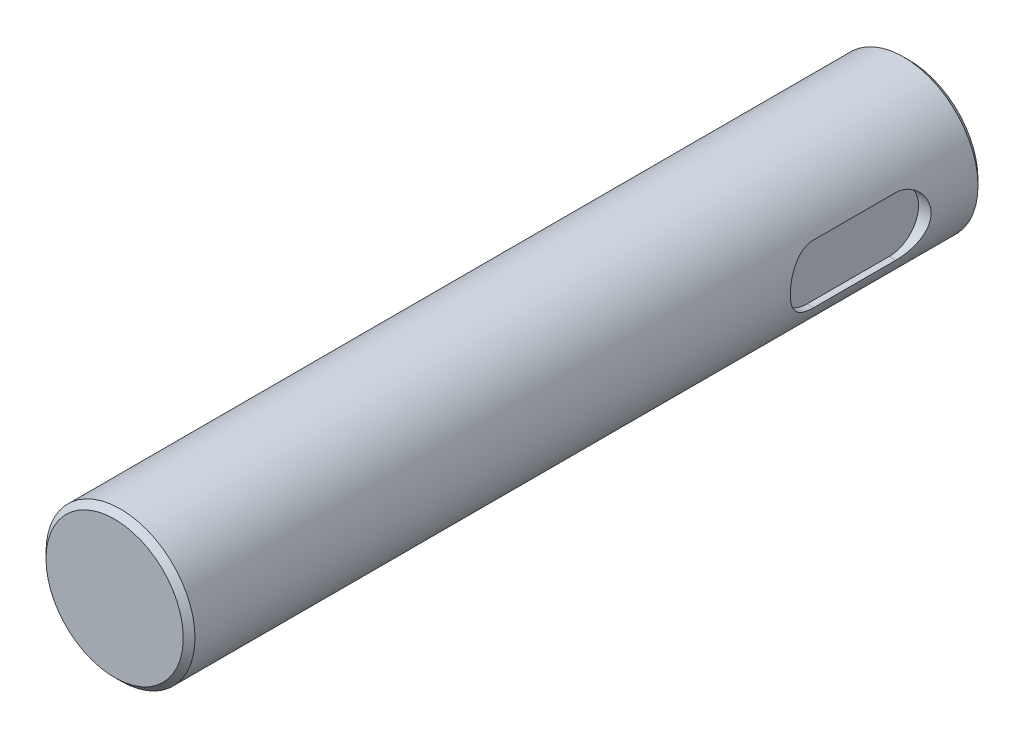
ISO-10303-21;
HEADER;
FILE_DESCRIPTION(('STEP AP214'),'2;1');
FILE_NAME('part.step','',(''),(''),'','','');
FILE_SCHEMA(('AUTOMOTIVE_DESIGN { 1 0 10303 214 1 1 1 1 }'));
ENDSEC;
DATA;
#1=APPLICATION_CONTEXT('core data for automotive mechanical design processes');
#2=APPLICATION_PROTOCOL_DEFINITION('international standard','automotive_design',2000,#1);
#3=PRODUCT_CONTEXT('',#1,'mechanical');
#4=PRODUCT('Part','Part','',(#3));
#5=PRODUCT_RELATED_PRODUCT_CATEGORY('part','',(#4));
#6=PRODUCT_DEFINITION_FORMATION('','',#4);
#7=PRODUCT_DEFINITION_CONTEXT('part definition',#1,'design');
#8=PRODUCT_DEFINITION('design','',#6,#7);
#9=PRODUCT_DEFINITION_SHAPE('','',#8);
#10=(LENGTH_UNIT() NAMED_UNIT(*) SI_UNIT(.MILLI.,.METRE.));
#11=(NAMED_UNIT(*) PLANE_ANGLE_UNIT() SI_UNIT($,.RADIAN.));
#12=(NAMED_UNIT(*) SI_UNIT($,.STERADIAN.) SOLID_ANGLE_UNIT());
#13=UNCERTAINTY_MEASURE_WITH_UNIT(LENGTH_MEASURE(1.E-05),#10,'distance_accuracy_value','');
#14=(GEOMETRIC_REPRESENTATION_CONTEXT(3) GLOBAL_UNCERTAINTY_ASSIGNED_CONTEXT((#13)) GLOBAL_UNIT_ASSIGNED_CONTEXT((#10,
#11,#12)) REPRESENTATION_CONTEXT('',''));
#15=CARTESIAN_POINT('',(0.,0.,0.));
#16=DIRECTION('',(0.,0.,1.));
#17=DIRECTION('',(1.,0.,0.));
#18=AXIS2_PLACEMENT_3D('',#15,#16,#17);
#19=CARTESIAN_POINT('',(0.,0.,-67.75));
#20=DIRECTION('',(0.,0.,1.));
#21=DIRECTION('',(1.,0.,0.));
#22=AXIS2_PLACEMENT_3D('',#19,#20,#21);
#23=PLANE('',#22);
#24=CARTESIAN_POINT('',(0.,0.,-67.75));
#25=DIRECTION('',(0.,0.,1.));
#26=DIRECTION('',(1.,0.,0.));
#27=AXIS2_PLACEMENT_3D('',#24,#25,#26);
#28=CIRCLE('',#27,5.84999999999999);
#29=CARTESIAN_POINT('',(5.84999999999999,0.,-67.75));
#30=VERTEX_POINT('',#29);
#31=EDGE_CURVE('E125',#30,#30,#28,.F.);
#32=ORIENTED_EDGE('',*,*,#31,.T.);
#33=EDGE_LOOP('',(#32));
#34=FACE_BOUND('',#33,.T.);
#35=ADVANCED_FACE('F39',(#34),#23,.F.);
#36=CARTESIAN_POINT('',(0.,0.,0.));
#37=DIRECTION('',(0.,0.,1.));
#38=DIRECTION('',(1.,0.,0.));
#39=AXIS2_PLACEMENT_3D('',#36,#37,#38);
#40=CYLINDRICAL_SURFACE('',#39,6.35);
#41=DIRECTION('',(0.,0.,1.));
#42=VECTOR('',#41,1.);
#43=CARTESIAN_POINT('',(5.83716540796987,2.5,0.));
#44=LINE('',#43,#42);
#45=CARTESIAN_POINT('',(5.83716540796987,2.5,-53.75));
#46=VERTEX_POINT('',#45);
#47=CARTESIAN_POINT('',(5.83716540796987,2.5,-60.75));
#48=VERTEX_POINT('',#47);
#49=EDGE_CURVE('E11',#46,#48,#44,.F.);
#50=ORIENTED_EDGE('',*,*,#49,.T.);
#51=CARTESIAN_POINT('',(5.83716540796987,2.5,-60.75));
#52=CARTESIAN_POINT('',(5.8371518919221,2.50000987478213,-60.8173550812143));
#53=CARTESIAN_POINT('',(5.83833089695258,2.49727823819387,-60.8847027700808));
#54=CARTESIAN_POINT('',(5.84297299306989,2.48640909552985,-61.018857101362));
#55=CARTESIAN_POINT('',(5.84643524116455,2.47827358460103,-61.0856639342537));
#56=CARTESIAN_POINT('',(5.85552556625778,2.45671510047975,-61.2180068502714));
#57=CARTESIAN_POINT('',(5.86114529843872,2.44331249493611,-61.2835468200074));
#58=CARTESIAN_POINT('',(5.87435928229259,2.41136898179004,-61.413143515974));
#59=CARTESIAN_POINT('',(5.88195364922099,2.39282777425358,-61.4772001553879));
#60=CARTESIAN_POINT('',(5.90734146262765,2.3297830960617,-61.6663660513068));
#61=CARTESIAN_POINT('',(5.92775864688554,2.2778161933338,-61.7887275416302));
#62=CARTESIAN_POINT('',(5.97326182534834,2.15566005868811,-62.0230441619064));
#63=CARTESIAN_POINT('',(5.99835209337196,2.08545412267192,-62.1349896240946));
#64=CARTESIAN_POINT('',(6.0519032396005,1.924703225297,-62.3514261808795));
#65=CARTESIAN_POINT('',(6.08046963387795,1.83332125628766,-62.4552708715946));
#66=CARTESIAN_POINT('',(6.13687860758837,1.63458906115231,-62.6466172492597));
#67=CARTESIAN_POINT('',(6.16472103971432,1.52723561466619,-62.7341156322274));
#68=CARTESIAN_POINT('',(6.21782414353303,1.29457106072578,-62.8935270160531));
#69=CARTESIAN_POINT('',(6.24294610873363,1.16873175753819,-62.9647195548644));
#70=CARTESIAN_POINT('',(6.28648865354135,0.9056993877024,-63.08464693297));
#71=CARTESIAN_POINT('',(6.30491195227754,0.768510955724711,-63.1333908867623));
#72=CARTESIAN_POINT('',(6.33222833403855,0.493523064939962,-63.2047200097026));
#73=CARTESIAN_POINT('',(6.341529158504,0.356056272193898,-63.2284284005797));
#74=CARTESIAN_POINT('',(6.351023804053,0.0787992330405364,-63.2526257750494));
#75=CARTESIAN_POINT('',(6.3512207410461,-0.0609902020288036,-63.2531227030312));
#76=CARTESIAN_POINT('',(6.34273602340464,-0.330820384385018,-63.2315076911508));
#77=CARTESIAN_POINT('',(6.33453718300954,-0.460977525113898,-63.2106252259453));
#78=CARTESIAN_POINT('',(6.31082863654111,-0.715765136693252,-63.1489299706289));
#79=CARTESIAN_POINT('',(6.29531851600277,-0.840395293789415,-63.1081160506304));
#80=CARTESIAN_POINT('',(6.25821672153607,-1.0828199291725,-63.0072113727838));
#81=CARTESIAN_POINT('',(6.23653747489002,-1.20048413314028,-62.9468411623745));
#82=CARTESIAN_POINT('',(6.18925968154747,-1.4243139627364,-62.8087945086935));
#83=CARTESIAN_POINT('',(6.1636597838798,-1.53047560321871,-62.7311120957972));
#84=CARTESIAN_POINT('',(6.109222290015,-1.73547129987141,-62.5548700018132));
#85=CARTESIAN_POINT('',(6.08028233057431,-1.83340642084681,-62.4552949148351));
#86=CARTESIAN_POINT('',(6.02369286608497,-2.01156229908132,-62.2409866036205));
#87=CARTESIAN_POINT('',(5.99604393068416,-2.09177529385489,-62.1262467720874));
#88=CARTESIAN_POINT('',(5.94447412112461,-2.23419669705954,-61.8809390613136));
#89=CARTESIAN_POINT('',(5.92067477322377,-2.29585745886071,-61.7500261587005));
#90=CARTESIAN_POINT('',(5.88093522688929,-2.39583746377496,-61.4785567890377));
#91=CARTESIAN_POINT('',(5.8649813239036,-2.43419743686662,-61.3380176302308));
#92=CARTESIAN_POINT('',(5.84852785117289,-2.47334005569358,-61.1216981406457));
#93=CARTESIAN_POINT('',(5.84428585186628,-2.48332518307775,-61.0477571313768));
#94=CARTESIAN_POINT('',(5.83859880772277,-2.49665534609488,-60.8992260128261));
#95=CARTESIAN_POINT('',(5.83715179627329,-2.50000505059412,-60.8246363970651));
#96=CARTESIAN_POINT('',(5.83716540796986,-2.5,-60.75));
#97=B_SPLINE_CURVE_WITH_KNOTS('',3,(#51,#52,#53,#54,#55,#56,#57,#58,#59,#60,#61,#62,#63,#64,#65,
#66,#67,#68,#69,#70,#71,#72,#73,#74,#75,#76,#77,#78,#79,#80,#81,#82,#83,#84,#85,#86,#87,#88,#89,
#90,#91,#92,#93,#94,#95,#96),.UNSPECIFIED.,.F.,.F.,(4,2,2,2,2,2,2,2,2,2,2,2,2,2,2,2,2,2,2,2,2,2,
4),(0.,0.201987224760544,0.403899915893151,0.605039382214785,0.806190591278725,1.20772153227728,
1.60962151713862,2.03148309093361,2.45342984107112,2.89144603935135,3.32928423865767,
3.7465149344843,4.16360282727851,4.5579822242233,4.9523839806073,5.35269047160806,
5.75313521117212,6.1791150998532,6.60528120411173,7.04301191062807,7.47997524151536,
7.7038630882788,7.92759334535097),.UNSPECIFIED.);
#98=CARTESIAN_POINT('',(5.83716540796987,-2.5,-60.75));
#99=VERTEX_POINT('',#98);
#100=EDGE_CURVE('E133',#48,#99,#97,.T.);
#101=ORIENTED_EDGE('',*,*,#100,.T.);
#102=DIRECTION('',(0.,0.,1.));
#103=VECTOR('',#102,1.);
#104=CARTESIAN_POINT('',(5.83716540796987,-2.5,0.));
#105=LINE('',#104,#103);
#106=CARTESIAN_POINT('',(5.83716540796987,-2.5,-53.75));
#107=VERTEX_POINT('',#106);
#108=EDGE_CURVE('E48',#99,#107,#105,.T.);
#109=ORIENTED_EDGE('',*,*,#108,.T.);
#110=CARTESIAN_POINT('',(5.83716540796987,-2.5,-53.75));
#111=CARTESIAN_POINT('',(5.8371518919221,-2.50000987478213,-53.6826449187857));
#112=CARTESIAN_POINT('',(5.83833089695258,-2.49727823819387,-53.6152972299192));
#113=CARTESIAN_POINT('',(5.84297299306989,-2.48640909552985,-53.481142898638));
#114=CARTESIAN_POINT('',(5.84643524116455,-2.47827358460103,-53.4143360657463));
#115=CARTESIAN_POINT('',(5.85552556625778,-2.45671510047975,-53.2819931497286));
#116=CARTESIAN_POINT('',(5.86114529843872,-2.44331249493611,-53.2164531799927));
#117=CARTESIAN_POINT('',(5.87435928229259,-2.41136898179004,-53.086856484026));
#118=CARTESIAN_POINT('',(5.88195364922098,-2.39282777425358,-53.0227998446122));
#119=CARTESIAN_POINT('',(5.90734146262765,-2.3297830960617,-52.8336339486932));
#120=CARTESIAN_POINT('',(5.92775864688554,-2.2778161933338,-52.7112724583699));
#121=CARTESIAN_POINT('',(5.97326182534834,-2.15566005868811,-52.4769558380936));
#122=CARTESIAN_POINT('',(5.99835209337196,-2.08545412267192,-52.3650103759054));
#123=CARTESIAN_POINT('',(6.0519032396005,-1.924703225297,-52.1485738191205));
#124=CARTESIAN_POINT('',(6.08046963387795,-1.83332125628765,-52.0447291284054));
#125=CARTESIAN_POINT('',(6.13687860758838,-1.6345890611523,-51.8533827507403));
#126=CARTESIAN_POINT('',(6.16472103971432,-1.52723561466618,-51.7658843677726));
#127=CARTESIAN_POINT('',(6.21782414353303,-1.29457106072577,-51.6064729839469));
#128=CARTESIAN_POINT('',(6.24294610873363,-1.16873175753818,-51.5352804451356));
#129=CARTESIAN_POINT('',(6.28648865354135,-0.90569938770239,-51.41535306703));
#130=CARTESIAN_POINT('',(6.30491195227754,-0.768510955724701,-51.3666091132377));
#131=CARTESIAN_POINT('',(6.33222833403855,-0.493523064939954,-51.2952799902974));
#132=CARTESIAN_POINT('',(6.341529158504,-0.356056272193893,-51.2715715994203));
#133=CARTESIAN_POINT('',(6.351023804053,-0.0787992330405341,-51.2473742249506));
#134=CARTESIAN_POINT('',(6.3512207410461,0.0609902020288047,-51.2468772969688));
#135=CARTESIAN_POINT('',(6.34273602340464,0.330820384385017,-51.2684923088492));
#136=CARTESIAN_POINT('',(6.33453718300954,0.460977525113896,-51.2893747740547));
#137=CARTESIAN_POINT('',(6.31082863654111,0.71576513669325,-51.3510700293711));
#138=CARTESIAN_POINT('',(6.29531851600277,0.840395293789414,-51.3918839493696));
#139=CARTESIAN_POINT('',(6.25821672153607,1.0828199291725,-51.4927886272162));
#140=CARTESIAN_POINT('',(6.23653747489002,1.20048413314028,-51.5531588376255));
#141=CARTESIAN_POINT('',(6.18925968154747,1.4243139627364,-51.6912054913066));
#142=CARTESIAN_POINT('',(6.1636597838798,1.5304756032187,-51.7688879042028));
#143=CARTESIAN_POINT('',(6.109222290015,1.73547129987141,-51.9451299981868));
#144=CARTESIAN_POINT('',(6.08028233057431,1.83340642084681,-52.0447050851649));
#145=CARTESIAN_POINT('',(6.02369286608497,2.01156229908132,-52.2590133963795));
#146=CARTESIAN_POINT('',(5.99604393068416,2.09177529385489,-52.3737532279126));
#147=CARTESIAN_POINT('',(5.9444741211246,2.23419669705954,-52.6190609386864));
#148=CARTESIAN_POINT('',(5.92067477322377,2.29585745886071,-52.7499738412995));
#149=CARTESIAN_POINT('',(5.88093522688929,2.39583746377496,-53.0214432109623));
#150=CARTESIAN_POINT('',(5.8649813239036,2.43419743686662,-53.1619823697692));
#151=CARTESIAN_POINT('',(5.84852785117289,2.47334005569358,-53.3783018593543));
#152=CARTESIAN_POINT('',(5.84428585186628,2.48332518307775,-53.4522428686232));
#153=CARTESIAN_POINT('',(5.83859880772277,2.49665534609488,-53.6007739871739));
#154=CARTESIAN_POINT('',(5.83715179627329,2.50000505059412,-53.675363602935));
#155=CARTESIAN_POINT('',(5.83716540796986,2.5,-53.75));
#156=B_SPLINE_CURVE_WITH_KNOTS('',3,(#110,#111,#112,#113,#114,#115,#116,#117,#118,#119,#120,
#121,#122,#123,#124,#125,#126,#127,#128,#129,#130,#131,#132,#133,#134,#135,#136,#137,#138,#139,
#140,#141,#142,#143,#144,#145,#146,#147,#148,#149,#150,#151,#152,#153,#154,#155),.UNSPECIFIED.,
.F.,.F.,(4,2,2,2,2,2,2,2,2,2,2,2,2,2,2,2,2,2,2,2,2,2,4),(0.,0.201987224760551,0.403899915893151,
0.605039382214778,0.806190591278725,1.20772153227728,1.60962151713862,2.03148309093364,
2.45342984107113,2.89144603935136,3.32928423865768,3.74651493448431,4.16360282727851,
4.5579822242233,4.9523839806073,5.35269047160806,5.75313521117212,6.1791150998532,
6.60528120411173,7.04301191062808,7.47997524151536,7.70386308827881,7.92759334535097),.UNSPECIFIED.);
#157=EDGE_CURVE('E55',#107,#46,#156,.T.);
#158=ORIENTED_EDGE('',*,*,#157,.T.);
#159=EDGE_LOOP('',(#50,#101,#109,#158));
#160=FACE_BOUND('',#159,.T.);
#161=CARTESIAN_POINT('',(0.,0.,-67.25));
#162=DIRECTION('',(0.,0.,1.));
#163=DIRECTION('',(1.,0.,0.));
#164=AXIS2_PLACEMENT_3D('',#161,#162,#163);
#165=CIRCLE('',#164,6.35);
#166=CARTESIAN_POINT('',(6.35,0.,-67.25));
#167=VERTEX_POINT('',#166);
#168=EDGE_CURVE('E121',#167,#167,#165,.T.);
#169=ORIENTED_EDGE('',*,*,#168,.T.);
#170=EDGE_LOOP('',(#169));
#171=FACE_BOUND('',#170,.T.);
#172=CARTESIAN_POINT('',(0.,0.,-0.500000000000007));
#173=DIRECTION('',(0.,0.,-1.));
#174=DIRECTION('',(-1.,0.,0.));
#175=AXIS2_PLACEMENT_3D('',#172,#173,#174);
#176=CIRCLE('',#175,6.35);
#177=CARTESIAN_POINT('',(-6.35,0.,-0.500000000000007));
#178=VERTEX_POINT('',#177);
#179=EDGE_CURVE('E112',#178,#178,#176,.T.);
#180=ORIENTED_EDGE('',*,*,#179,.T.);
#181=EDGE_LOOP('',(#180));
#182=FACE_BOUND('',#181,.T.);
#183=ADVANCED_FACE('F148',(#160,#171,#182),#40,.T.);
#184=CARTESIAN_POINT('',(0.,0.,0.));
#185=DIRECTION('',(0.,0.,-1.));
#186=DIRECTION('',(-1.,0.,0.));
#187=AXIS2_PLACEMENT_3D('',#184,#185,#186);
#188=PLANE('',#187);
#189=CARTESIAN_POINT('',(0.,0.,0.));
#190=DIRECTION('',(0.,0.,-1.));
#191=DIRECTION('',(-1.,0.,0.));
#192=AXIS2_PLACEMENT_3D('',#189,#190,#191);
#193=CIRCLE('',#192,5.84999999999999);
#194=CARTESIAN_POINT('',(-5.84999999999999,0.,0.));
#195=VERTEX_POINT('',#194);
#196=EDGE_CURVE('E129',#195,#195,#193,.F.);
#197=ORIENTED_EDGE('',*,*,#196,.T.);
#198=EDGE_LOOP('',(#197));
#199=FACE_BOUND('',#198,.T.);
#200=ADVANCED_FACE('F163',(#199),#188,.F.);
#201=CARTESIAN_POINT('',(0.,0.,-67.25));
#202=DIRECTION('',(0.,0.,1.));
#203=DIRECTION('',(1.,0.,0.));
#204=AXIS2_PLACEMENT_3D('',#201,#202,#203);
#205=CONICAL_SURFACE('',#204,6.35,0.785398163397454);
#206=ORIENTED_EDGE('',*,*,#31,.F.);
#207=EDGE_LOOP('',(#206));
#208=FACE_BOUND('',#207,.T.);
#209=ORIENTED_EDGE('',*,*,#168,.F.);
#210=EDGE_LOOP('',(#209));
#211=FACE_BOUND('',#210,.T.);
#212=ADVANCED_FACE('F165',(#208,#211),#205,.T.);
#213=CARTESIAN_POINT('',(0.,0.,0.));
#214=DIRECTION('',(0.,0.,-1.));
#215=DIRECTION('',(-1.,0.,0.));
#216=AXIS2_PLACEMENT_3D('',#213,#214,#215);
#217=CONICAL_SURFACE('',#216,5.84999999999999,0.785398163397447);
#218=ORIENTED_EDGE('',*,*,#179,.F.);
#219=EDGE_LOOP('',(#218));
#220=FACE_BOUND('',#219,.T.);
#221=ORIENTED_EDGE('',*,*,#196,.F.);
#222=EDGE_LOOP('',(#221));
#223=FACE_BOUND('',#222,.T.);
#224=ADVANCED_FACE('F41',(#220,#223),#217,.T.);
#225=CARTESIAN_POINT('',(5.275,0.,-53.75));
#226=DIRECTION('',(1.,0.,0.));
#227=DIRECTION('',(0.,0.,-1.));
#228=AXIS2_PLACEMENT_3D('',#225,#226,#227);
#229=CYLINDRICAL_SURFACE('',#228,2.5);
#230=DIRECTION('',(1.,0.,0.));
#231=VECTOR('',#230,1.);
#232=CARTESIAN_POINT('',(5.275,-2.5,-53.75));
#233=LINE('',#232,#231);
#234=CARTESIAN_POINT('',(5.275,-2.5,-53.75));
#235=VERTEX_POINT('',#234);
#236=EDGE_CURVE('E78',#235,#107,#233,.T.);
#237=ORIENTED_EDGE('',*,*,#236,.F.);
#238=CARTESIAN_POINT('',(5.275,0.,-53.75));
#239=DIRECTION('',(1.,0.,0.));
#240=DIRECTION('',(0.,0.,-1.));
#241=AXIS2_PLACEMENT_3D('',#238,#239,#240);
#242=CIRCLE('',#241,2.5);
#243=CARTESIAN_POINT('',(5.275,2.5,-53.75));
#244=VERTEX_POINT('',#243);
#245=EDGE_CURVE('E82',#244,#235,#242,.T.);
#246=ORIENTED_EDGE('',*,*,#245,.F.);
#247=DIRECTION('',(1.,0.,0.));
#248=VECTOR('',#247,1.);
#249=CARTESIAN_POINT('',(5.275,2.5,-53.75));
#250=LINE('',#249,#248);
#251=EDGE_CURVE('E109',#244,#46,#250,.T.);
#252=ORIENTED_EDGE('',*,*,#251,.T.);
#253=ORIENTED_EDGE('',*,*,#157,.F.);
#254=EDGE_LOOP('',(#237,#246,#252,#253));
#255=FACE_BOUND('',#254,.T.);
#256=ADVANCED_FACE('F80',(#255),#229,.F.);
#257=CARTESIAN_POINT('',(5.275,2.5,-53.75));
#258=DIRECTION('',(0.,1.,0.));
#259=DIRECTION('',(0.,0.,1.));
#260=AXIS2_PLACEMENT_3D('',#257,#258,#259);
#261=PLANE('',#260);
#262=ORIENTED_EDGE('',*,*,#251,.F.);
#263=DIRECTION('',(0.,0.,1.));
#264=VECTOR('',#263,1.);
#265=CARTESIAN_POINT('',(5.275,2.5,-53.75));
#266=LINE('',#265,#264);
#267=CARTESIAN_POINT('',(5.275,2.5,-60.75));
#268=VERTEX_POINT('',#267);
#269=EDGE_CURVE('E88',#268,#244,#266,.T.);
#270=ORIENTED_EDGE('',*,*,#269,.F.);
#271=DIRECTION('',(1.,0.,0.));
#272=VECTOR('',#271,1.);
#273=CARTESIAN_POINT('',(5.275,2.5,-60.75));
#274=LINE('',#273,#272);
#275=EDGE_CURVE('E113',#268,#48,#274,.T.);
#276=ORIENTED_EDGE('',*,*,#275,.T.);
#277=ORIENTED_EDGE('',*,*,#49,.F.);
#278=EDGE_LOOP('',(#262,#270,#276,#277));
#279=FACE_BOUND('',#278,.T.);
#280=ADVANCED_FACE('F157',(#279),#261,.F.);
#281=CARTESIAN_POINT('',(5.275,0.,-60.75));
#282=DIRECTION('',(1.,0.,0.));
#283=DIRECTION('',(0.,0.,-1.));
#284=AXIS2_PLACEMENT_3D('',#281,#282,#283);
#285=CYLINDRICAL_SURFACE('',#284,2.5);
#286=ORIENTED_EDGE('',*,*,#275,.F.);
#287=CARTESIAN_POINT('',(5.275,0.,-60.75));
#288=DIRECTION('',(1.,0.,0.));
#289=DIRECTION('',(0.,0.,-1.));
#290=AXIS2_PLACEMENT_3D('',#287,#288,#289);
#291=CIRCLE('',#290,2.5);
#292=CARTESIAN_POINT('',(5.275,-2.5,-60.75));
#293=VERTEX_POINT('',#292);
#294=EDGE_CURVE('E98',#293,#268,#291,.T.);
#295=ORIENTED_EDGE('',*,*,#294,.F.);
#296=DIRECTION('',(1.,0.,0.));
#297=VECTOR('',#296,1.);
#298=CARTESIAN_POINT('',(5.275,-2.5,-60.75));
#299=LINE('',#298,#297);
#300=EDGE_CURVE('E87',#293,#99,#299,.T.);
#301=ORIENTED_EDGE('',*,*,#300,.T.);
#302=ORIENTED_EDGE('',*,*,#100,.F.);
#303=EDGE_LOOP('',(#286,#295,#301,#302));
#304=FACE_BOUND('',#303,.T.);
#305=ADVANCED_FACE('F152',(#304),#285,.F.);
#306=CARTESIAN_POINT('',(5.275,-2.5,-53.75));
#307=DIRECTION('',(0.,-1.,0.));
#308=DIRECTION('',(0.,0.,-1.));
#309=AXIS2_PLACEMENT_3D('',#306,#307,#308);
#310=PLANE('',#309);
#311=ORIENTED_EDGE('',*,*,#300,.F.);
#312=DIRECTION('',(0.,0.,-1.));
#313=VECTOR('',#312,1.);
#314=CARTESIAN_POINT('',(5.275,-2.5,-53.75));
#315=LINE('',#314,#313);
#316=EDGE_CURVE('E91',#235,#293,#315,.T.);
#317=ORIENTED_EDGE('',*,*,#316,.F.);
#318=ORIENTED_EDGE('',*,*,#236,.T.);
#319=ORIENTED_EDGE('',*,*,#108,.F.);
#320=EDGE_LOOP('',(#311,#317,#318,#319));
#321=FACE_BOUND('',#320,.T.);
#322=ADVANCED_FACE('F92',(#321),#310,.F.);
#323=CARTESIAN_POINT('',(5.275,0.,-53.75));
#324=DIRECTION('',(1.,0.,0.));
#325=DIRECTION('',(0.,0.,-1.));
#326=AXIS2_PLACEMENT_3D('',#323,#324,#325);
#327=PLANE('',#326);
#328=ORIENTED_EDGE('',*,*,#245,.T.);
#329=ORIENTED_EDGE('',*,*,#316,.T.);
#330=ORIENTED_EDGE('',*,*,#294,.T.);
#331=ORIENTED_EDGE('',*,*,#269,.T.);
#332=EDGE_LOOP('',(#328,#329,#330,#331));
#333=FACE_BOUND('',#332,.T.);
#334=ADVANCED_FACE('F100',(#333),#327,.T.);
#335=CLOSED_SHELL('',(#35,#183,#200,#212,#224,#256,#280,#305,#322,#334));
#336=MANIFOLD_SOLID_BREP('B2',#335);
#337=ADVANCED_BREP_SHAPE_REPRESENTATION('',(#18,#336),#14);
#338=SHAPE_DEFINITION_REPRESENTATION(#9,#337);
ENDSEC;
END-ISO-10303-21;
